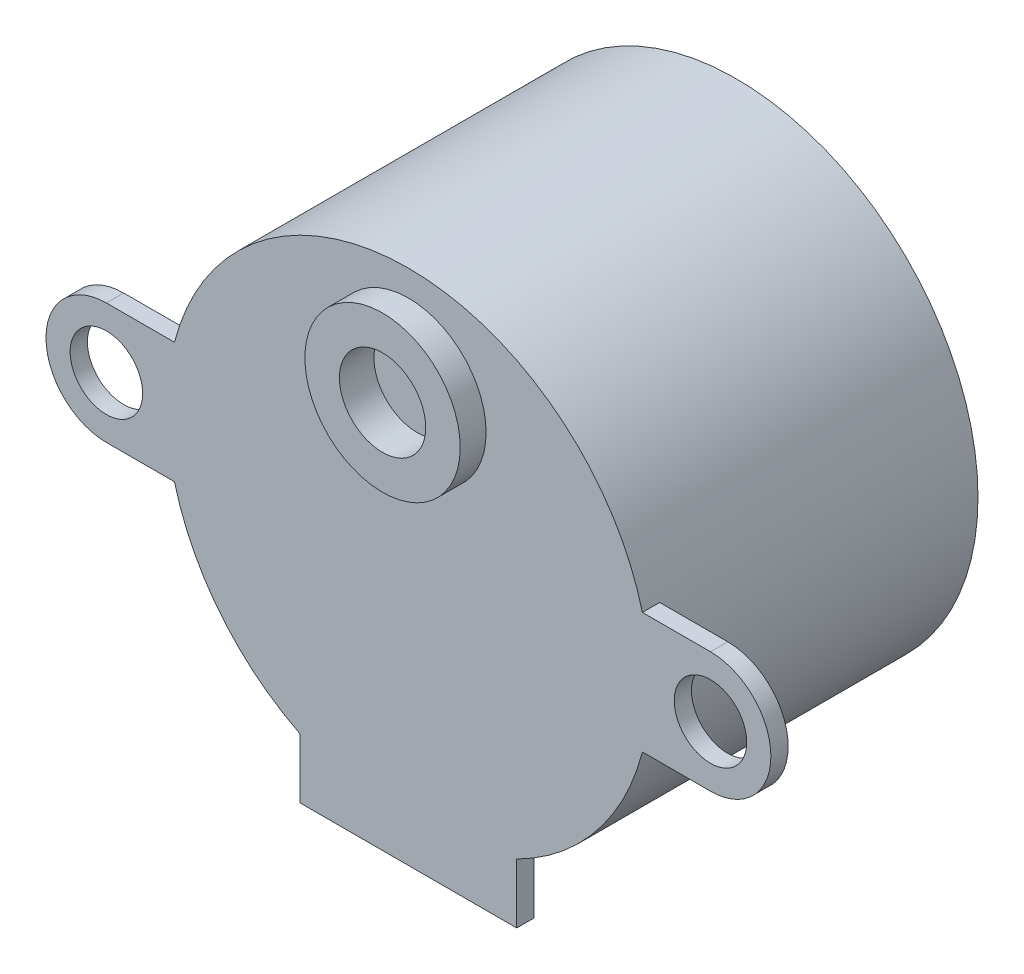
ISO-10303-21;
HEADER;
FILE_DESCRIPTION(('STEP AP214'),'2;1');
FILE_NAME('part.step','',(''),(''),'','','');
FILE_SCHEMA(('AUTOMOTIVE_DESIGN { 1 0 10303 214 1 1 1 1 }'));
ENDSEC;
DATA;
#1=APPLICATION_CONTEXT('core data for automotive mechanical design processes');
#2=APPLICATION_PROTOCOL_DEFINITION('international standard','automotive_design',2000,#1);
#3=PRODUCT_CONTEXT('',#1,'mechanical');
#4=PRODUCT('Part','Part','',(#3));
#5=PRODUCT_RELATED_PRODUCT_CATEGORY('part','',(#4));
#6=PRODUCT_DEFINITION_FORMATION('','',#4);
#7=PRODUCT_DEFINITION_CONTEXT('part definition',#1,'design');
#8=PRODUCT_DEFINITION('design','',#6,#7);
#9=PRODUCT_DEFINITION_SHAPE('','',#8);
#10=(LENGTH_UNIT() NAMED_UNIT(*) SI_UNIT(.MILLI.,.METRE.));
#11=(NAMED_UNIT(*) PLANE_ANGLE_UNIT() SI_UNIT($,.RADIAN.));
#12=(NAMED_UNIT(*) SI_UNIT($,.STERADIAN.) SOLID_ANGLE_UNIT());
#13=UNCERTAINTY_MEASURE_WITH_UNIT(LENGTH_MEASURE(1.E-05),#10,'distance_accuracy_value','');
#14=(GEOMETRIC_REPRESENTATION_CONTEXT(3) GLOBAL_UNCERTAINTY_ASSIGNED_CONTEXT((#13)) GLOBAL_UNIT_ASSIGNED_CONTEXT((#10,
#11,#12)) REPRESENTATION_CONTEXT('',''));
#15=CARTESIAN_POINT('',(0.,0.,0.));
#16=DIRECTION('',(0.,0.,1.));
#17=DIRECTION('',(1.,0.,0.));
#18=AXIS2_PLACEMENT_3D('',#15,#16,#17);
#19=CARTESIAN_POINT('',(-17.5,-3.5,-19.));
#20=DIRECTION('',(0.,-1.,0.));
#21=DIRECTION('',(1.,0.,0.));
#22=AXIS2_PLACEMENT_3D('',#19,#20,#21);
#23=PLANE('',#22);
#24=DIRECTION('',(0.,0.,1.));
#25=VECTOR('',#24,1.);
#26=CARTESIAN_POINT('',(-17.5,-3.5,-19.));
#27=LINE('',#26,#25);
#28=CARTESIAN_POINT('',(-17.5,-3.5,-1.));
#29=VERTEX_POINT('',#28);
#30=CARTESIAN_POINT('',(-17.5,-3.5,0.));
#31=VERTEX_POINT('',#30);
#32=EDGE_CURVE('E230',#29,#31,#27,.T.);
#33=ORIENTED_EDGE('',*,*,#32,.F.);
#34=DIRECTION('',(-1.,0.,0.));
#35=VECTOR('',#34,1.);
#36=CARTESIAN_POINT('',(-17.5,-3.5,-1.));
#37=LINE('',#36,#35);
#38=CARTESIAN_POINT('',(-13.555441711726,-3.49999999999999,-1.));
#39=VERTEX_POINT('',#38);
#40=EDGE_CURVE('E172',#39,#29,#37,.T.);
#41=ORIENTED_EDGE('',*,*,#40,.F.);
#42=DIRECTION('',(0.,0.,1.));
#43=VECTOR('',#42,1.);
#44=CARTESIAN_POINT('',(-13.555441711726,-3.49999999999999,-19.));
#45=LINE('',#44,#43);
#46=CARTESIAN_POINT('',(-13.555441711726,-3.49999999999999,0.));
#47=VERTEX_POINT('',#46);
#48=EDGE_CURVE('E228',#39,#47,#45,.T.);
#49=ORIENTED_EDGE('',*,*,#48,.T.);
#50=DIRECTION('',(1.,0.,0.));
#51=VECTOR('',#50,1.);
#52=CARTESIAN_POINT('',(-17.5,-3.5,0.));
#53=LINE('',#52,#51);
#54=EDGE_CURVE('E209',#31,#47,#53,.T.);
#55=ORIENTED_EDGE('',*,*,#54,.F.);
#56=EDGE_LOOP('',(#33,#41,#49,#55));
#57=FACE_BOUND('',#56,.T.);
#58=ADVANCED_FACE('F34',(#57),#23,.T.);
#59=CARTESIAN_POINT('',(-17.5,0.,-19.));
#60=DIRECTION('',(0.,0.,1.));
#61=DIRECTION('',(1.,0.,0.));
#62=AXIS2_PLACEMENT_3D('',#59,#60,#61);
#63=CYLINDRICAL_SURFACE('',#62,3.5);
#64=DIRECTION('',(0.,0.,1.));
#65=VECTOR('',#64,1.);
#66=CARTESIAN_POINT('',(-17.5,3.5,-19.));
#67=LINE('',#66,#65);
#68=CARTESIAN_POINT('',(-17.5,3.5,-1.));
#69=VERTEX_POINT('',#68);
#70=CARTESIAN_POINT('',(-17.5,3.5,0.));
#71=VERTEX_POINT('',#70);
#72=EDGE_CURVE('E232',#69,#71,#67,.T.);
#73=ORIENTED_EDGE('',*,*,#72,.F.);
#74=CARTESIAN_POINT('',(-17.5,0.,-1.));
#75=DIRECTION('',(0.,0.,-1.));
#76=DIRECTION('',(1.,0.,0.));
#77=AXIS2_PLACEMENT_3D('',#74,#75,#76);
#78=CIRCLE('',#77,3.5);
#79=EDGE_CURVE('E174',#29,#69,#78,.T.);
#80=ORIENTED_EDGE('',*,*,#79,.F.);
#81=ORIENTED_EDGE('',*,*,#32,.T.);
#82=CARTESIAN_POINT('',(-17.5,0.,0.));
#83=DIRECTION('',(0.,0.,1.));
#84=DIRECTION('',(1.,0.,0.));
#85=AXIS2_PLACEMENT_3D('',#82,#83,#84);
#86=CIRCLE('',#85,3.5);
#87=EDGE_CURVE('E206',#71,#31,#86,.T.);
#88=ORIENTED_EDGE('',*,*,#87,.F.);
#89=EDGE_LOOP('',(#73,#80,#81,#88));
#90=FACE_BOUND('',#89,.T.);
#91=ADVANCED_FACE('F256',(#90),#63,.T.);
#92=CARTESIAN_POINT('',(-13.555441711726,3.5,-19.));
#93=DIRECTION('',(0.,1.,0.));
#94=DIRECTION('',(0.,0.,1.));
#95=AXIS2_PLACEMENT_3D('',#92,#93,#94);
#96=PLANE('',#95);
#97=DIRECTION('',(0.,0.,1.));
#98=VECTOR('',#97,1.);
#99=CARTESIAN_POINT('',(-13.555441711726,3.5,-19.));
#100=LINE('',#99,#98);
#101=CARTESIAN_POINT('',(-13.555441711726,3.5,-1.));
#102=VERTEX_POINT('',#101);
#103=CARTESIAN_POINT('',(-13.555441711726,3.5,0.));
#104=VERTEX_POINT('',#103);
#105=EDGE_CURVE('E199',#102,#104,#100,.T.);
#106=ORIENTED_EDGE('',*,*,#105,.F.);
#107=DIRECTION('',(1.,0.,0.));
#108=VECTOR('',#107,1.);
#109=CARTESIAN_POINT('',(-13.555441711726,3.5,-1.));
#110=LINE('',#109,#108);
#111=EDGE_CURVE('E176',#69,#102,#110,.T.);
#112=ORIENTED_EDGE('',*,*,#111,.F.);
#113=ORIENTED_EDGE('',*,*,#72,.T.);
#114=DIRECTION('',(-1.,0.,0.));
#115=VECTOR('',#114,1.);
#116=CARTESIAN_POINT('',(-13.555441711726,3.5,0.));
#117=LINE('',#116,#115);
#118=EDGE_CURVE('E203',#104,#71,#117,.T.);
#119=ORIENTED_EDGE('',*,*,#118,.F.);
#120=EDGE_LOOP('',(#106,#112,#113,#119));
#121=FACE_BOUND('',#120,.T.);
#122=ADVANCED_FACE('F36',(#121),#96,.T.);
#123=CARTESIAN_POINT('',(-17.5,0.,-19.));
#124=DIRECTION('',(0.,0.,1.));
#125=DIRECTION('',(1.,0.,0.));
#126=AXIS2_PLACEMENT_3D('',#123,#124,#125);
#127=CYLINDRICAL_SURFACE('',#126,2.1);
#128=CARTESIAN_POINT('',(-17.5,0.,0.));
#129=DIRECTION('',(0.,0.,1.));
#130=DIRECTION('',(1.,0.,0.));
#131=AXIS2_PLACEMENT_3D('',#128,#129,#130);
#132=CIRCLE('',#131,2.1);
#133=CARTESIAN_POINT('',(-15.4,0.,0.));
#134=VERTEX_POINT('',#133);
#135=EDGE_CURVE('E189',#134,#134,#132,.T.);
#136=ORIENTED_EDGE('',*,*,#135,.T.);
#137=EDGE_LOOP('',(#136));
#138=FACE_BOUND('',#137,.T.);
#139=CARTESIAN_POINT('',(-17.5,0.,-1.));
#140=DIRECTION('',(0.,0.,-1.));
#141=DIRECTION('',(-1.,0.,0.));
#142=AXIS2_PLACEMENT_3D('',#139,#140,#141);
#143=CIRCLE('',#142,2.1);
#144=CARTESIAN_POINT('',(-19.6,0.,-1.));
#145=VERTEX_POINT('',#144);
#146=EDGE_CURVE('E38',#145,#145,#143,.F.);
#147=ORIENTED_EDGE('',*,*,#146,.F.);
#148=EDGE_LOOP('',(#147));
#149=FACE_BOUND('',#148,.T.);
#150=ADVANCED_FACE('F271',(#138,#149),#127,.F.);
#151=CARTESIAN_POINT('',(13.555441711726,3.5,-19.));
#152=DIRECTION('',(0.,1.,0.));
#153=DIRECTION('',(-1.,0.,0.));
#154=AXIS2_PLACEMENT_3D('',#151,#152,#153);
#155=PLANE('',#154);
#156=DIRECTION('',(0.,0.,1.));
#157=VECTOR('',#156,1.);
#158=CARTESIAN_POINT('',(17.5,3.5,-19.));
#159=LINE('',#158,#157);
#160=CARTESIAN_POINT('',(17.5,3.5,-1.));
#161=VERTEX_POINT('',#160);
#162=CARTESIAN_POINT('',(17.5,3.5,0.));
#163=VERTEX_POINT('',#162);
#164=EDGE_CURVE('E43',#161,#163,#159,.T.);
#165=ORIENTED_EDGE('',*,*,#164,.F.);
#166=DIRECTION('',(1.,0.,0.));
#167=VECTOR('',#166,1.);
#168=CARTESIAN_POINT('',(13.555441711726,3.5,-1.));
#169=LINE('',#168,#167);
#170=CARTESIAN_POINT('',(13.555441711726,3.5,-1.));
#171=VERTEX_POINT('',#170);
#172=EDGE_CURVE('E181',#171,#161,#169,.T.);
#173=ORIENTED_EDGE('',*,*,#172,.F.);
#174=DIRECTION('',(0.,0.,1.));
#175=VECTOR('',#174,1.);
#176=CARTESIAN_POINT('',(13.555441711726,3.5,-19.));
#177=LINE('',#176,#175);
#178=CARTESIAN_POINT('',(13.555441711726,3.5,0.));
#179=VERTEX_POINT('',#178);
#180=EDGE_CURVE('E11',#171,#179,#177,.T.);
#181=ORIENTED_EDGE('',*,*,#180,.T.);
#182=DIRECTION('',(-1.,0.,0.));
#183=VECTOR('',#182,1.);
#184=CARTESIAN_POINT('',(13.555441711726,3.5,0.));
#185=LINE('',#184,#183);
#186=EDGE_CURVE('E200',#163,#179,#185,.T.);
#187=ORIENTED_EDGE('',*,*,#186,.F.);
#188=EDGE_LOOP('',(#165,#173,#181,#187));
#189=FACE_BOUND('',#188,.T.);
#190=ADVANCED_FACE('F267',(#189),#155,.T.);
#191=CARTESIAN_POINT('',(17.5,0.,-19.));
#192=DIRECTION('',(0.,0.,1.));
#193=DIRECTION('',(1.,0.,0.));
#194=AXIS2_PLACEMENT_3D('',#191,#192,#193);
#195=CYLINDRICAL_SURFACE('',#194,3.5);
#196=DIRECTION('',(0.,0.,1.));
#197=VECTOR('',#196,1.);
#198=CARTESIAN_POINT('',(17.5,-3.5,-19.));
#199=LINE('',#198,#197);
#200=CARTESIAN_POINT('',(17.5,-3.5,-1.));
#201=VERTEX_POINT('',#200);
#202=CARTESIAN_POINT('',(17.5,-3.5,0.));
#203=VERTEX_POINT('',#202);
#204=EDGE_CURVE('E224',#201,#203,#199,.T.);
#205=ORIENTED_EDGE('',*,*,#204,.F.);
#206=CARTESIAN_POINT('',(17.5,0.,-1.));
#207=DIRECTION('',(0.,0.,-1.));
#208=DIRECTION('',(-1.,0.,0.));
#209=AXIS2_PLACEMENT_3D('',#206,#207,#208);
#210=CIRCLE('',#209,3.5);
#211=EDGE_CURVE('E183',#161,#201,#210,.T.);
#212=ORIENTED_EDGE('',*,*,#211,.F.);
#213=ORIENTED_EDGE('',*,*,#164,.T.);
#214=CARTESIAN_POINT('',(17.5,0.,0.));
#215=DIRECTION('',(0.,0.,1.));
#216=DIRECTION('',(-1.,0.,0.));
#217=AXIS2_PLACEMENT_3D('',#214,#215,#216);
#218=CIRCLE('',#217,3.5);
#219=EDGE_CURVE('E218',#203,#163,#218,.T.);
#220=ORIENTED_EDGE('',*,*,#219,.F.);
#221=EDGE_LOOP('',(#205,#212,#213,#220));
#222=FACE_BOUND('',#221,.T.);
#223=ADVANCED_FACE('F250',(#222),#195,.T.);
#224=CARTESIAN_POINT('',(17.5,-3.5,-19.));
#225=DIRECTION('',(0.,-1.,0.));
#226=DIRECTION('',(1.,0.,0.));
#227=AXIS2_PLACEMENT_3D('',#224,#225,#226);
#228=PLANE('',#227);
#229=DIRECTION('',(0.,0.,1.));
#230=VECTOR('',#229,1.);
#231=CARTESIAN_POINT('',(13.555441711726,-3.5,-19.));
#232=LINE('',#231,#230);
#233=CARTESIAN_POINT('',(13.555441711726,-3.5,-1.));
#234=VERTEX_POINT('',#233);
#235=CARTESIAN_POINT('',(13.555441711726,-3.5,0.));
#236=VERTEX_POINT('',#235);
#237=EDGE_CURVE('E226',#234,#236,#232,.T.);
#238=ORIENTED_EDGE('',*,*,#237,.F.);
#239=DIRECTION('',(-1.,0.,0.));
#240=VECTOR('',#239,1.);
#241=CARTESIAN_POINT('',(17.5,-3.5,-1.));
#242=LINE('',#241,#240);
#243=EDGE_CURVE('E185',#201,#234,#242,.T.);
#244=ORIENTED_EDGE('',*,*,#243,.F.);
#245=ORIENTED_EDGE('',*,*,#204,.T.);
#246=DIRECTION('',(1.,0.,0.));
#247=VECTOR('',#246,1.);
#248=CARTESIAN_POINT('',(17.5,-3.5,0.));
#249=LINE('',#248,#247);
#250=EDGE_CURVE('E215',#236,#203,#249,.T.);
#251=ORIENTED_EDGE('',*,*,#250,.F.);
#252=EDGE_LOOP('',(#238,#244,#245,#251));
#253=FACE_BOUND('',#252,.T.);
#254=ADVANCED_FACE('F241',(#253),#228,.T.);
#255=CARTESIAN_POINT('',(17.5,0.,-19.));
#256=DIRECTION('',(0.,0.,1.));
#257=DIRECTION('',(1.,0.,0.));
#258=AXIS2_PLACEMENT_3D('',#255,#256,#257);
#259=CYLINDRICAL_SURFACE('',#258,2.1);
#260=CARTESIAN_POINT('',(17.5,0.,0.));
#261=DIRECTION('',(0.,0.,1.));
#262=DIRECTION('',(1.,0.,0.));
#263=AXIS2_PLACEMENT_3D('',#260,#261,#262);
#264=CIRCLE('',#263,2.1);
#265=CARTESIAN_POINT('',(19.6,0.,0.));
#266=VERTEX_POINT('',#265);
#267=EDGE_CURVE('E192',#266,#266,#264,.T.);
#268=ORIENTED_EDGE('',*,*,#267,.T.);
#269=EDGE_LOOP('',(#268));
#270=FACE_BOUND('',#269,.T.);
#271=CARTESIAN_POINT('',(17.5,0.,-1.));
#272=DIRECTION('',(0.,0.,-1.));
#273=DIRECTION('',(-1.,0.,0.));
#274=AXIS2_PLACEMENT_3D('',#271,#272,#273);
#275=CIRCLE('',#274,2.1);
#276=CARTESIAN_POINT('',(15.4,0.,-1.));
#277=VERTEX_POINT('',#276);
#278=EDGE_CURVE('E188',#277,#277,#275,.F.);
#279=ORIENTED_EDGE('',*,*,#278,.F.);
#280=EDGE_LOOP('',(#279));
#281=FACE_BOUND('',#280,.T.);
#282=ADVANCED_FACE('F239',(#270,#281),#259,.F.);
#283=CARTESIAN_POINT('',(0.,0.,-19.));
#284=DIRECTION('',(0.,0.,1.));
#285=DIRECTION('',(1.,0.,0.));
#286=AXIS2_PLACEMENT_3D('',#283,#284,#285);
#287=CYLINDRICAL_SURFACE('',#286,14.);
#288=DIRECTION('',(0.,0.,1.));
#289=VECTOR('',#288,1.);
#290=CARTESIAN_POINT('',(6.27499999999999,-12.514966040705,-1.));
#291=LINE('',#290,#289);
#292=CARTESIAN_POINT('',(6.27499999999999,-12.514966040705,-1.));
#293=VERTEX_POINT('',#292);
#294=CARTESIAN_POINT('',(6.27499999999999,-12.514966040705,0.));
#295=VERTEX_POINT('',#294);
#296=EDGE_CURVE('E141',#293,#295,#291,.T.);
#297=ORIENTED_EDGE('',*,*,#296,.F.);
#298=CARTESIAN_POINT('',(0.,0.,-1.));
#299=DIRECTION('',(0.,0.,-1.));
#300=DIRECTION('',(1.,0.,0.));
#301=AXIS2_PLACEMENT_3D('',#298,#299,#300);
#302=CIRCLE('',#301,14.);
#303=CARTESIAN_POINT('',(-6.275,-12.514966040705,-1.));
#304=VERTEX_POINT('',#303);
#305=EDGE_CURVE('E127',#293,#304,#302,.T.);
#306=ORIENTED_EDGE('',*,*,#305,.T.);
#307=DIRECTION('',(0.,0.,1.));
#308=VECTOR('',#307,1.);
#309=CARTESIAN_POINT('',(-6.275,-12.514966040705,-1.));
#310=LINE('',#309,#308);
#311=CARTESIAN_POINT('',(-6.275,-12.514966040705,0.));
#312=VERTEX_POINT('',#311);
#313=EDGE_CURVE('E150',#304,#312,#310,.T.);
#314=ORIENTED_EDGE('',*,*,#313,.T.);
#315=CARTESIAN_POINT('',(0.,0.,0.));
#316=DIRECTION('',(0.,0.,1.));
#317=DIRECTION('',(1.,0.,0.));
#318=AXIS2_PLACEMENT_3D('',#315,#316,#317);
#319=CIRCLE('',#318,14.);
#320=EDGE_CURVE('E212',#47,#312,#319,.T.);
#321=ORIENTED_EDGE('',*,*,#320,.F.);
#322=ORIENTED_EDGE('',*,*,#48,.F.);
#323=CARTESIAN_POINT('',(0.,0.,-1.));
#324=DIRECTION('',(0.,0.,1.));
#325=DIRECTION('',(-1.,0.,0.));
#326=AXIS2_PLACEMENT_3D('',#323,#324,#325);
#327=CIRCLE('',#326,14.);
#328=EDGE_CURVE('E168',#102,#39,#327,.T.);
#329=ORIENTED_EDGE('',*,*,#328,.F.);
#330=ORIENTED_EDGE('',*,*,#105,.T.);
#331=CARTESIAN_POINT('',(0.,0.,0.));
#332=DIRECTION('',(0.,0.,1.));
#333=DIRECTION('',(1.,0.,0.));
#334=AXIS2_PLACEMENT_3D('',#331,#332,#333);
#335=CIRCLE('',#334,14.);
#336=EDGE_CURVE('E195',#179,#104,#335,.T.);
#337=ORIENTED_EDGE('',*,*,#336,.F.);
#338=ORIENTED_EDGE('',*,*,#180,.F.);
#339=CARTESIAN_POINT('',(0.,0.,-1.));
#340=DIRECTION('',(0.,0.,1.));
#341=DIRECTION('',(-1.,0.,0.));
#342=AXIS2_PLACEMENT_3D('',#339,#340,#341);
#343=CIRCLE('',#342,14.);
#344=EDGE_CURVE('E179',#234,#171,#343,.T.);
#345=ORIENTED_EDGE('',*,*,#344,.F.);
#346=ORIENTED_EDGE('',*,*,#237,.T.);
#347=EDGE_CURVE('E149',#295,#236,#319,.T.);
#348=ORIENTED_EDGE('',*,*,#347,.F.);
#349=EDGE_LOOP('',(#297,#306,#314,#321,#322,#329,#330,#337,#338,#345,#346,#348));
#350=FACE_BOUND('',#349,.T.);
#351=CARTESIAN_POINT('',(0.,0.,-19.));
#352=DIRECTION('',(0.,0.,1.));
#353=DIRECTION('',(1.,0.,0.));
#354=AXIS2_PLACEMENT_3D('',#351,#352,#353);
#355=CIRCLE('',#354,14.);
#356=CARTESIAN_POINT('',(14.,0.,-19.));
#357=VERTEX_POINT('',#356);
#358=EDGE_CURVE('E196',#357,#357,#355,.T.);
#359=ORIENTED_EDGE('',*,*,#358,.T.);
#360=EDGE_LOOP('',(#359));
#361=FACE_BOUND('',#360,.T.);
#362=ADVANCED_FACE('F146',(#350,#361),#287,.T.);
#363=CARTESIAN_POINT('',(0.,0.,-19.));
#364=DIRECTION('',(0.,0.,1.));
#365=DIRECTION('',(1.,0.,0.));
#366=AXIS2_PLACEMENT_3D('',#363,#364,#365);
#367=PLANE('',#366);
#368=ORIENTED_EDGE('',*,*,#358,.F.);
#369=EDGE_LOOP('',(#368));
#370=FACE_BOUND('',#369,.T.);
#371=ADVANCED_FACE('F248',(#370),#367,.F.);
#372=CARTESIAN_POINT('',(0.,0.,0.));
#373=DIRECTION('',(0.,0.,1.));
#374=DIRECTION('',(1.,0.,0.));
#375=AXIS2_PLACEMENT_3D('',#372,#373,#374);
#376=PLANE('',#375);
#377=CARTESIAN_POINT('',(0.,8.,0.));
#378=DIRECTION('',(0.,0.,1.));
#379=DIRECTION('',(1.,0.,0.));
#380=AXIS2_PLACEMENT_3D('',#377,#378,#379);
#381=CIRCLE('',#380,4.5);
#382=CARTESIAN_POINT('',(4.5,8.,0.));
#383=VERTEX_POINT('',#382);
#384=EDGE_CURVE('E161',#383,#383,#381,.T.);
#385=ORIENTED_EDGE('',*,*,#384,.F.);
#386=EDGE_LOOP('',(#385));
#387=FACE_BOUND('',#386,.T.);
#388=ORIENTED_EDGE('',*,*,#135,.F.);
#389=EDGE_LOOP('',(#388));
#390=FACE_BOUND('',#389,.T.);
#391=ORIENTED_EDGE('',*,*,#267,.F.);
#392=EDGE_LOOP('',(#391));
#393=FACE_BOUND('',#392,.T.);
#394=ORIENTED_EDGE('',*,*,#336,.T.);
#395=ORIENTED_EDGE('',*,*,#118,.T.);
#396=ORIENTED_EDGE('',*,*,#87,.T.);
#397=ORIENTED_EDGE('',*,*,#54,.T.);
#398=ORIENTED_EDGE('',*,*,#320,.T.);
#399=DIRECTION('',(0.,-1.,0.));
#400=VECTOR('',#399,1.);
#401=CARTESIAN_POINT('',(-6.275,-15.975,0.));
#402=LINE('',#401,#400);
#403=CARTESIAN_POINT('',(-6.275,-15.975,0.));
#404=VERTEX_POINT('',#403);
#405=EDGE_CURVE('E466',#312,#404,#402,.T.);
#406=ORIENTED_EDGE('',*,*,#405,.T.);
#407=DIRECTION('',(1.,0.,0.));
#408=VECTOR('',#407,1.);
#409=CARTESIAN_POINT('',(-6.275,-15.975,0.));
#410=LINE('',#409,#408);
#411=CARTESIAN_POINT('',(6.275,-15.975,0.));
#412=VERTEX_POINT('',#411);
#413=EDGE_CURVE('E144',#404,#412,#410,.T.);
#414=ORIENTED_EDGE('',*,*,#413,.T.);
#415=DIRECTION('',(0.,1.,0.));
#416=VECTOR('',#415,1.);
#417=CARTESIAN_POINT('',(6.275,-15.975,0.));
#418=LINE('',#417,#416);
#419=EDGE_CURVE('E51',#412,#295,#418,.T.);
#420=ORIENTED_EDGE('',*,*,#419,.T.);
#421=ORIENTED_EDGE('',*,*,#347,.T.);
#422=ORIENTED_EDGE('',*,*,#250,.T.);
#423=ORIENTED_EDGE('',*,*,#219,.T.);
#424=ORIENTED_EDGE('',*,*,#186,.T.);
#425=EDGE_LOOP('',(#394,#395,#396,#397,#398,#406,#414,#420,#421,#422,#423,#424));
#426=FACE_BOUND('',#425,.T.);
#427=ADVANCED_FACE('F272',(#387,#390,#393,#426),#376,.T.);
#428=CARTESIAN_POINT('',(0.,0.,-1.));
#429=DIRECTION('',(0.,0.,-1.));
#430=DIRECTION('',(-1.,0.,0.));
#431=AXIS2_PLACEMENT_3D('',#428,#429,#430);
#432=PLANE('',#431);
#433=ORIENTED_EDGE('',*,*,#344,.T.);
#434=ORIENTED_EDGE('',*,*,#172,.T.);
#435=ORIENTED_EDGE('',*,*,#211,.T.);
#436=ORIENTED_EDGE('',*,*,#243,.T.);
#437=EDGE_LOOP('',(#433,#434,#435,#436));
#438=FACE_BOUND('',#437,.T.);
#439=ORIENTED_EDGE('',*,*,#278,.T.);
#440=EDGE_LOOP('',(#439));
#441=FACE_BOUND('',#440,.T.);
#442=ADVANCED_FACE('F237',(#438,#441),#432,.T.);
#443=CARTESIAN_POINT('',(0.,0.,-1.));
#444=DIRECTION('',(0.,0.,-1.));
#445=DIRECTION('',(-1.,0.,0.));
#446=AXIS2_PLACEMENT_3D('',#443,#444,#445);
#447=PLANE('',#446);
#448=ORIENTED_EDGE('',*,*,#328,.T.);
#449=ORIENTED_EDGE('',*,*,#40,.T.);
#450=ORIENTED_EDGE('',*,*,#79,.T.);
#451=ORIENTED_EDGE('',*,*,#111,.T.);
#452=EDGE_LOOP('',(#448,#449,#450,#451));
#453=FACE_BOUND('',#452,.T.);
#454=ORIENTED_EDGE('',*,*,#146,.T.);
#455=EDGE_LOOP('',(#454));
#456=FACE_BOUND('',#455,.T.);
#457=ADVANCED_FACE('F293',(#453,#456),#447,.T.);
#458=CARTESIAN_POINT('',(0.,8.,1.5));
#459=DIRECTION('',(0.,0.,-1.));
#460=DIRECTION('',(-1.,0.,0.));
#461=AXIS2_PLACEMENT_3D('',#458,#459,#460);
#462=CYLINDRICAL_SURFACE('',#461,4.5);
#463=CARTESIAN_POINT('',(0.,8.,1.5));
#464=DIRECTION('',(0.,0.,1.));
#465=DIRECTION('',(1.,0.,0.));
#466=AXIS2_PLACEMENT_3D('',#463,#464,#465);
#467=CIRCLE('',#466,4.5);
#468=CARTESIAN_POINT('',(4.5,8.,1.5));
#469=VERTEX_POINT('',#468);
#470=EDGE_CURVE('E165',#469,#469,#467,.T.);
#471=ORIENTED_EDGE('',*,*,#470,.F.);
#472=EDGE_LOOP('',(#471));
#473=FACE_BOUND('',#472,.T.);
#474=ORIENTED_EDGE('',*,*,#384,.T.);
#475=EDGE_LOOP('',(#474));
#476=FACE_BOUND('',#475,.T.);
#477=ADVANCED_FACE('F301',(#473,#476),#462,.T.);
#478=CARTESIAN_POINT('',(0.,8.,1.5));
#479=DIRECTION('',(0.,0.,1.));
#480=DIRECTION('',(1.,0.,0.));
#481=AXIS2_PLACEMENT_3D('',#478,#479,#480);
#482=PLANE('',#481);
#483=CARTESIAN_POINT('',(0.,8.,1.5));
#484=DIRECTION('',(0.,0.,1.));
#485=DIRECTION('',(1.,0.,0.));
#486=AXIS2_PLACEMENT_3D('',#483,#484,#485);
#487=CIRCLE('',#486,2.5);
#488=CARTESIAN_POINT('',(2.5,8.,1.5));
#489=VERTEX_POINT('',#488);
#490=EDGE_CURVE('E162',#489,#489,#487,.T.);
#491=ORIENTED_EDGE('',*,*,#490,.F.);
#492=EDGE_LOOP('',(#491));
#493=FACE_BOUND('',#492,.T.);
#494=ORIENTED_EDGE('',*,*,#470,.T.);
#495=EDGE_LOOP('',(#494));
#496=FACE_BOUND('',#495,.T.);
#497=ADVANCED_FACE('F309',(#493,#496),#482,.T.);
#498=CARTESIAN_POINT('',(0.,8.,-0.5));
#499=DIRECTION('',(0.,0.,1.));
#500=DIRECTION('',(1.,0.,0.));
#501=AXIS2_PLACEMENT_3D('',#498,#499,#500);
#502=CYLINDRICAL_SURFACE('',#501,2.5);
#503=CARTESIAN_POINT('',(0.,8.,-0.5));
#504=DIRECTION('',(0.,0.,1.));
#505=DIRECTION('',(1.,0.,0.));
#506=AXIS2_PLACEMENT_3D('',#503,#504,#505);
#507=CIRCLE('',#506,2.5);
#508=CARTESIAN_POINT('',(2.5,8.,-0.5));
#509=VERTEX_POINT('',#508);
#510=EDGE_CURVE('E158',#509,#509,#507,.T.);
#511=ORIENTED_EDGE('',*,*,#510,.F.);
#512=EDGE_LOOP('',(#511));
#513=FACE_BOUND('',#512,.T.);
#514=ORIENTED_EDGE('',*,*,#490,.T.);
#515=EDGE_LOOP('',(#514));
#516=FACE_BOUND('',#515,.T.);
#517=ADVANCED_FACE('F317',(#513,#516),#502,.F.);
#518=CARTESIAN_POINT('',(0.,8.,-0.5));
#519=DIRECTION('',(0.,0.,1.));
#520=DIRECTION('',(1.,0.,0.));
#521=AXIS2_PLACEMENT_3D('',#518,#519,#520);
#522=PLANE('',#521);
#523=ORIENTED_EDGE('',*,*,#510,.T.);
#524=EDGE_LOOP('',(#523));
#525=FACE_BOUND('',#524,.T.);
#526=ADVANCED_FACE('F325',(#525),#522,.T.);
#527=CARTESIAN_POINT('',(6.275,-15.975,-1.));
#528=DIRECTION('',(1.,0.,0.));
#529=DIRECTION('',(0.,0.,-1.));
#530=AXIS2_PLACEMENT_3D('',#527,#528,#529);
#531=PLANE('',#530);
#532=ORIENTED_EDGE('',*,*,#419,.F.);
#533=DIRECTION('',(0.,0.,1.));
#534=VECTOR('',#533,1.);
#535=CARTESIAN_POINT('',(6.275,-15.975,-1.));
#536=LINE('',#535,#534);
#537=CARTESIAN_POINT('',(6.275,-15.975,-1.));
#538=VERTEX_POINT('',#537);
#539=EDGE_CURVE('E143',#538,#412,#536,.T.);
#540=ORIENTED_EDGE('',*,*,#539,.F.);
#541=DIRECTION('',(0.,1.,0.));
#542=VECTOR('',#541,1.);
#543=CARTESIAN_POINT('',(6.275,-15.975,-1.));
#544=LINE('',#543,#542);
#545=EDGE_CURVE('E131',#538,#293,#544,.T.);
#546=ORIENTED_EDGE('',*,*,#545,.T.);
#547=ORIENTED_EDGE('',*,*,#296,.T.);
#548=EDGE_LOOP('',(#532,#540,#546,#547));
#549=FACE_BOUND('',#548,.T.);
#550=ADVANCED_FACE('F140',(#549),#531,.T.);
#551=CARTESIAN_POINT('',(-6.275,-15.975,-1.));
#552=DIRECTION('',(0.,-1.,0.));
#553=DIRECTION('',(0.,0.,-1.));
#554=AXIS2_PLACEMENT_3D('',#551,#552,#553);
#555=PLANE('',#554);
#556=ORIENTED_EDGE('',*,*,#413,.F.);
#557=DIRECTION('',(0.,0.,1.));
#558=VECTOR('',#557,1.);
#559=CARTESIAN_POINT('',(-6.275,-15.975,-1.));
#560=LINE('',#559,#558);
#561=CARTESIAN_POINT('',(-6.275,-15.975,-1.));
#562=VERTEX_POINT('',#561);
#563=EDGE_CURVE('E153',#562,#404,#560,.T.);
#564=ORIENTED_EDGE('',*,*,#563,.F.);
#565=DIRECTION('',(1.,0.,0.));
#566=VECTOR('',#565,1.);
#567=CARTESIAN_POINT('',(-6.275,-15.975,-1.));
#568=LINE('',#567,#566);
#569=EDGE_CURVE('E151',#562,#538,#568,.T.);
#570=ORIENTED_EDGE('',*,*,#569,.T.);
#571=ORIENTED_EDGE('',*,*,#539,.T.);
#572=EDGE_LOOP('',(#556,#564,#570,#571));
#573=FACE_BOUND('',#572,.T.);
#574=ADVANCED_FACE('F339',(#573),#555,.T.);
#575=CARTESIAN_POINT('',(-6.275,-15.975,-1.));
#576=DIRECTION('',(-1.,0.,0.));
#577=DIRECTION('',(0.,0.,1.));
#578=AXIS2_PLACEMENT_3D('',#575,#576,#577);
#579=PLANE('',#578);
#580=ORIENTED_EDGE('',*,*,#405,.F.);
#581=ORIENTED_EDGE('',*,*,#313,.F.);
#582=DIRECTION('',(0.,-1.,0.));
#583=VECTOR('',#582,1.);
#584=CARTESIAN_POINT('',(-6.275,-15.975,-1.));
#585=LINE('',#584,#583);
#586=EDGE_CURVE('E134',#304,#562,#585,.T.);
#587=ORIENTED_EDGE('',*,*,#586,.T.);
#588=ORIENTED_EDGE('',*,*,#563,.T.);
#589=EDGE_LOOP('',(#580,#581,#587,#588));
#590=FACE_BOUND('',#589,.T.);
#591=ADVANCED_FACE('F346',(#590),#579,.T.);
#592=CARTESIAN_POINT('',(0.,0.,-1.));
#593=DIRECTION('',(0.,0.,1.));
#594=DIRECTION('',(1.,0.,0.));
#595=AXIS2_PLACEMENT_3D('',#592,#593,#594);
#596=PLANE('',#595);
#597=ORIENTED_EDGE('',*,*,#545,.F.);
#598=ORIENTED_EDGE('',*,*,#569,.F.);
#599=ORIENTED_EDGE('',*,*,#586,.F.);
#600=ORIENTED_EDGE('',*,*,#305,.F.);
#601=EDGE_LOOP('',(#597,#598,#599,#600));
#602=FACE_BOUND('',#601,.T.);
#603=ADVANCED_FACE('F129',(#602),#596,.F.);
#604=CLOSED_SHELL('',(#58,#91,#122,#150,#190,#223,#254,#282,#362,#371,#427,#442,#457,#477,#497,
#517,#526,#550,#574,#591,#603));
#605=MANIFOLD_SOLID_BREP('B2',#604);
#606=ADVANCED_BREP_SHAPE_REPRESENTATION('',(#18,#605),#14);
#607=SHAPE_DEFINITION_REPRESENTATION(#9,#606);
ENDSEC;
END-ISO-10303-21;
